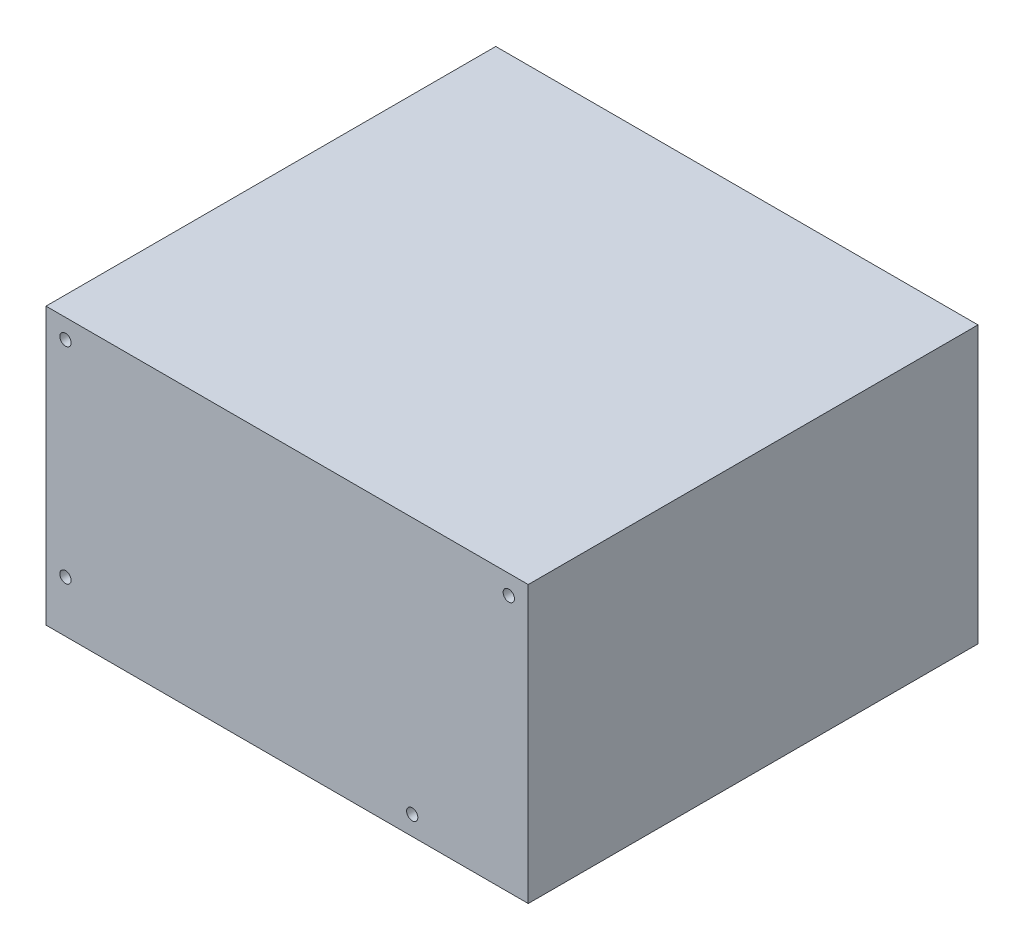
ISO-10303-21;
HEADER;
FILE_DESCRIPTION(('STEP AP214'),'2;1');
FILE_NAME('part.step','',(''),(''),'','','');
FILE_SCHEMA(('AUTOMOTIVE_DESIGN { 1 0 10303 214 1 1 1 1 }'));
ENDSEC;
DATA;
#1=APPLICATION_CONTEXT('core data for automotive mechanical design processes');
#2=APPLICATION_PROTOCOL_DEFINITION('international standard','automotive_design',2000,#1);
#3=PRODUCT_CONTEXT('',#1,'mechanical');
#4=PRODUCT('Part','Part','',(#3));
#5=PRODUCT_RELATED_PRODUCT_CATEGORY('part','',(#4));
#6=PRODUCT_DEFINITION_FORMATION('','',#4);
#7=PRODUCT_DEFINITION_CONTEXT('part definition',#1,'design');
#8=PRODUCT_DEFINITION('design','',#6,#7);
#9=PRODUCT_DEFINITION_SHAPE('','',#8);
#10=(LENGTH_UNIT() NAMED_UNIT(*) SI_UNIT(.MILLI.,.METRE.));
#11=(NAMED_UNIT(*) PLANE_ANGLE_UNIT() SI_UNIT($,.RADIAN.));
#12=(NAMED_UNIT(*) SI_UNIT($,.STERADIAN.) SOLID_ANGLE_UNIT());
#13=UNCERTAINTY_MEASURE_WITH_UNIT(LENGTH_MEASURE(1.E-05),#10,'distance_accuracy_value','');
#14=(GEOMETRIC_REPRESENTATION_CONTEXT(3) GLOBAL_UNCERTAINTY_ASSIGNED_CONTEXT((#13)) GLOBAL_UNIT_ASSIGNED_CONTEXT((#10,
#11,#12)) REPRESENTATION_CONTEXT('',''));
#15=CARTESIAN_POINT('',(0.,0.,0.));
#16=DIRECTION('',(0.,0.,1.));
#17=DIRECTION('',(1.,0.,0.));
#18=AXIS2_PLACEMENT_3D('',#15,#16,#17);
#19=CARTESIAN_POINT('',(0.,0.,-140.));
#20=DIRECTION('',(0.,-1.,0.));
#21=DIRECTION('',(0.,0.,-1.));
#22=AXIS2_PLACEMENT_3D('',#19,#20,#21);
#23=PLANE('',#22);
#24=DIRECTION('',(1.,0.,0.));
#25=VECTOR('',#24,1.);
#26=CARTESIAN_POINT('',(0.,0.,0.));
#27=LINE('',#26,#25);
#28=CARTESIAN_POINT('',(0.,0.,0.));
#29=VERTEX_POINT('',#28);
#30=CARTESIAN_POINT('',(150.114,0.,0.));
#31=VERTEX_POINT('',#30);
#32=EDGE_CURVE('E101',#29,#31,#27,.T.);
#33=ORIENTED_EDGE('',*,*,#32,.F.);
#34=DIRECTION('',(0.,0.,1.));
#35=VECTOR('',#34,1.);
#36=CARTESIAN_POINT('',(0.,0.,-140.));
#37=LINE('',#36,#35);
#38=CARTESIAN_POINT('',(0.,0.,-140.));
#39=VERTEX_POINT('',#38);
#40=EDGE_CURVE('E11',#39,#29,#37,.T.);
#41=ORIENTED_EDGE('',*,*,#40,.F.);
#42=DIRECTION('',(1.,0.,0.));
#43=VECTOR('',#42,1.);
#44=CARTESIAN_POINT('',(0.,0.,-140.));
#45=LINE('',#44,#43);
#46=CARTESIAN_POINT('',(150.114,0.,-140.));
#47=VERTEX_POINT('',#46);
#48=EDGE_CURVE('E95',#39,#47,#45,.T.);
#49=ORIENTED_EDGE('',*,*,#48,.T.);
#50=DIRECTION('',(0.,0.,1.));
#51=VECTOR('',#50,1.);
#52=CARTESIAN_POINT('',(150.114,0.,-140.));
#53=LINE('',#52,#51);
#54=EDGE_CURVE('E38',#47,#31,#53,.T.);
#55=ORIENTED_EDGE('',*,*,#54,.T.);
#56=EDGE_LOOP('',(#33,#41,#49,#55));
#57=FACE_BOUND('',#56,.T.);
#58=ADVANCED_FACE('F35',(#57),#23,.T.);
#59=CARTESIAN_POINT('',(0.,0.,-140.));
#60=DIRECTION('',(1.,0.,0.));
#61=DIRECTION('',(0.,1.,0.));
#62=AXIS2_PLACEMENT_3D('',#59,#60,#61);
#63=PLANE('',#62);
#64=DIRECTION('',(0.,1.,0.));
#65=VECTOR('',#64,1.);
#66=CARTESIAN_POINT('',(0.,0.,0.));
#67=LINE('',#66,#65);
#68=CARTESIAN_POINT('',(0.,86.,0.));
#69=VERTEX_POINT('',#68);
#70=EDGE_CURVE('E68',#29,#69,#67,.T.);
#71=ORIENTED_EDGE('',*,*,#70,.T.);
#72=DIRECTION('',(0.,0.,1.));
#73=VECTOR('',#72,1.);
#74=CARTESIAN_POINT('',(0.,86.,-140.));
#75=LINE('',#74,#73);
#76=CARTESIAN_POINT('',(0.,86.,-140.));
#77=VERTEX_POINT('',#76);
#78=EDGE_CURVE('E44',#77,#69,#75,.T.);
#79=ORIENTED_EDGE('',*,*,#78,.F.);
#80=DIRECTION('',(0.,1.,0.));
#81=VECTOR('',#80,1.);
#82=CARTESIAN_POINT('',(0.,0.,-140.));
#83=LINE('',#82,#81);
#84=EDGE_CURVE('E85',#39,#77,#83,.T.);
#85=ORIENTED_EDGE('',*,*,#84,.F.);
#86=ORIENTED_EDGE('',*,*,#40,.T.);
#87=EDGE_LOOP('',(#71,#79,#85,#86));
#88=FACE_BOUND('',#87,.T.);
#89=ADVANCED_FACE('F112',(#88),#63,.F.);
#90=CARTESIAN_POINT('',(0.,86.,-140.));
#91=DIRECTION('',(0.,-1.,0.));
#92=DIRECTION('',(0.,0.,-1.));
#93=AXIS2_PLACEMENT_3D('',#90,#91,#92);
#94=PLANE('',#93);
#95=DIRECTION('',(1.,0.,0.));
#96=VECTOR('',#95,1.);
#97=CARTESIAN_POINT('',(0.,86.,0.));
#98=LINE('',#97,#96);
#99=CARTESIAN_POINT('',(150.114,86.,0.));
#100=VERTEX_POINT('',#99);
#101=EDGE_CURVE('E92',#69,#100,#98,.T.);
#102=ORIENTED_EDGE('',*,*,#101,.T.);
#103=DIRECTION('',(0.,0.,1.));
#104=VECTOR('',#103,1.);
#105=CARTESIAN_POINT('',(150.114,86.,-140.));
#106=LINE('',#105,#104);
#107=CARTESIAN_POINT('',(150.114,86.,-140.));
#108=VERTEX_POINT('',#107);
#109=EDGE_CURVE('E89',#108,#100,#106,.T.);
#110=ORIENTED_EDGE('',*,*,#109,.F.);
#111=DIRECTION('',(1.,0.,0.));
#112=VECTOR('',#111,1.);
#113=CARTESIAN_POINT('',(0.,86.,-140.));
#114=LINE('',#113,#112);
#115=EDGE_CURVE('E80',#77,#108,#114,.T.);
#116=ORIENTED_EDGE('',*,*,#115,.F.);
#117=ORIENTED_EDGE('',*,*,#78,.T.);
#118=EDGE_LOOP('',(#102,#110,#116,#117));
#119=FACE_BOUND('',#118,.T.);
#120=ADVANCED_FACE('F90',(#119),#94,.F.);
#121=CARTESIAN_POINT('',(150.114,0.,-140.));
#122=DIRECTION('',(1.,0.,0.));
#123=DIRECTION('',(0.,1.,0.));
#124=AXIS2_PLACEMENT_3D('',#121,#122,#123);
#125=PLANE('',#124);
#126=DIRECTION('',(0.,1.,0.));
#127=VECTOR('',#126,1.);
#128=CARTESIAN_POINT('',(150.114,0.,0.));
#129=LINE('',#128,#127);
#130=EDGE_CURVE('E104',#31,#100,#129,.T.);
#131=ORIENTED_EDGE('',*,*,#130,.F.);
#132=ORIENTED_EDGE('',*,*,#54,.F.);
#133=DIRECTION('',(0.,1.,0.));
#134=VECTOR('',#133,1.);
#135=CARTESIAN_POINT('',(150.114,0.,-140.));
#136=LINE('',#135,#134);
#137=EDGE_CURVE('E84',#47,#108,#136,.T.);
#138=ORIENTED_EDGE('',*,*,#137,.T.);
#139=ORIENTED_EDGE('',*,*,#109,.T.);
#140=EDGE_LOOP('',(#131,#132,#138,#139));
#141=FACE_BOUND('',#140,.T.);
#142=ADVANCED_FACE('F94',(#141),#125,.T.);
#143=CARTESIAN_POINT('',(0.,0.,-140.));
#144=DIRECTION('',(0.,0.,1.));
#145=DIRECTION('',(1.,0.,0.));
#146=AXIS2_PLACEMENT_3D('',#143,#144,#145);
#147=PLANE('',#146);
#148=ORIENTED_EDGE('',*,*,#48,.F.);
#149=ORIENTED_EDGE('',*,*,#84,.T.);
#150=ORIENTED_EDGE('',*,*,#115,.T.);
#151=ORIENTED_EDGE('',*,*,#137,.F.);
#152=EDGE_LOOP('',(#148,#149,#150,#151));
#153=FACE_BOUND('',#152,.T.);
#154=ADVANCED_FACE('F83',(#153),#147,.F.);
#155=CARTESIAN_POINT('',(0.,0.,0.));
#156=DIRECTION('',(0.,0.,1.));
#157=DIRECTION('',(1.,0.,0.));
#158=AXIS2_PLACEMENT_3D('',#155,#156,#157);
#159=PLANE('',#158);
#160=CARTESIAN_POINT('',(114.,6.,0.));
#161=DIRECTION('',(0.,0.,1.));
#162=DIRECTION('',(1.,0.,0.));
#163=AXIS2_PLACEMENT_3D('',#160,#161,#162);
#164=CIRCLE('',#163,1.75259999999993);
#165=CARTESIAN_POINT('',(115.7526,6.,0.));
#166=VERTEX_POINT('',#165);
#167=EDGE_CURVE('E169',#166,#166,#164,.T.);
#168=ORIENTED_EDGE('',*,*,#167,.F.);
#169=EDGE_LOOP('',(#168));
#170=FACE_BOUND('',#169,.T.);
#171=CARTESIAN_POINT('',(6.0579,16.,0.));
#172=DIRECTION('',(0.,0.,1.));
#173=DIRECTION('',(1.,0.,0.));
#174=AXIS2_PLACEMENT_3D('',#171,#172,#173);
#175=CIRCLE('',#174,1.75259999999999);
#176=CARTESIAN_POINT('',(7.81049999999999,16.,0.));
#177=VERTEX_POINT('',#176);
#178=EDGE_CURVE('E168',#177,#177,#175,.T.);
#179=ORIENTED_EDGE('',*,*,#178,.F.);
#180=EDGE_LOOP('',(#179));
#181=FACE_BOUND('',#180,.T.);
#182=CARTESIAN_POINT('',(144.0561,80.,0.));
#183=DIRECTION('',(0.,0.,1.));
#184=DIRECTION('',(1.,0.,0.));
#185=AXIS2_PLACEMENT_3D('',#182,#183,#184);
#186=CIRCLE('',#185,1.75259999999991);
#187=CARTESIAN_POINT('',(145.8087,80.,0.));
#188=VERTEX_POINT('',#187);
#189=EDGE_CURVE('E178',#188,#188,#186,.T.);
#190=ORIENTED_EDGE('',*,*,#189,.F.);
#191=EDGE_LOOP('',(#190));
#192=FACE_BOUND('',#191,.T.);
#193=CARTESIAN_POINT('',(6.0579,80.,0.));
#194=DIRECTION('',(0.,0.,1.));
#195=DIRECTION('',(1.,0.,0.));
#196=AXIS2_PLACEMENT_3D('',#193,#194,#195);
#197=CIRCLE('',#196,1.75259999999994);
#198=CARTESIAN_POINT('',(7.81049999999995,80.,0.));
#199=VERTEX_POINT('',#198);
#200=EDGE_CURVE('E183',#199,#199,#197,.T.);
#201=ORIENTED_EDGE('',*,*,#200,.F.);
#202=EDGE_LOOP('',(#201));
#203=FACE_BOUND('',#202,.T.);
#204=ORIENTED_EDGE('',*,*,#32,.T.);
#205=ORIENTED_EDGE('',*,*,#130,.T.);
#206=ORIENTED_EDGE('',*,*,#101,.F.);
#207=ORIENTED_EDGE('',*,*,#70,.F.);
#208=EDGE_LOOP('',(#204,#205,#206,#207));
#209=FACE_BOUND('',#208,.T.);
#210=ADVANCED_FACE('F110',(#170,#181,#192,#203,#209),#159,.T.);
#211=CARTESIAN_POINT('',(6.0579,80.,-127.));
#212=DIRECTION('',(0.,0.,1.));
#213=DIRECTION('',(1.,0.,0.));
#214=AXIS2_PLACEMENT_3D('',#211,#212,#213);
#215=CYLINDRICAL_SURFACE('',#214,1.75259999999994);
#216=CARTESIAN_POINT('',(6.0579,80.,-127.));
#217=DIRECTION('',(0.,0.,1.));
#218=DIRECTION('',(1.,0.,0.));
#219=AXIS2_PLACEMENT_3D('',#216,#217,#218);
#220=CIRCLE('',#219,1.75259999999994);
#221=CARTESIAN_POINT('',(7.81049999999995,80.,-127.));
#222=VERTEX_POINT('',#221);
#223=EDGE_CURVE('E105',#222,#222,#220,.T.);
#224=ORIENTED_EDGE('',*,*,#223,.F.);
#225=EDGE_LOOP('',(#224));
#226=FACE_BOUND('',#225,.T.);
#227=ORIENTED_EDGE('',*,*,#200,.T.);
#228=EDGE_LOOP('',(#227));
#229=FACE_BOUND('',#228,.T.);
#230=ADVANCED_FACE('F130',(#226,#229),#215,.F.);
#231=CARTESIAN_POINT('',(0.,0.,-127.));
#232=DIRECTION('',(0.,0.,1.));
#233=DIRECTION('',(1.,0.,0.));
#234=AXIS2_PLACEMENT_3D('',#231,#232,#233);
#235=PLANE('',#234);
#236=ORIENTED_EDGE('',*,*,#223,.T.);
#237=EDGE_LOOP('',(#236));
#238=FACE_BOUND('',#237,.T.);
#239=ADVANCED_FACE('F135',(#238),#235,.T.);
#240=CARTESIAN_POINT('',(144.0561,80.,-127.));
#241=DIRECTION('',(0.,0.,1.));
#242=DIRECTION('',(1.,0.,0.));
#243=AXIS2_PLACEMENT_3D('',#240,#241,#242);
#244=CYLINDRICAL_SURFACE('',#243,1.75259999999991);
#245=CARTESIAN_POINT('',(144.0561,80.,-127.));
#246=DIRECTION('',(0.,0.,1.));
#247=DIRECTION('',(1.,0.,0.));
#248=AXIS2_PLACEMENT_3D('',#245,#246,#247);
#249=CIRCLE('',#248,1.75259999999991);
#250=CARTESIAN_POINT('',(145.8087,80.,-127.));
#251=VERTEX_POINT('',#250);
#252=EDGE_CURVE('E180',#251,#251,#249,.T.);
#253=ORIENTED_EDGE('',*,*,#252,.F.);
#254=EDGE_LOOP('',(#253));
#255=FACE_BOUND('',#254,.T.);
#256=ORIENTED_EDGE('',*,*,#189,.T.);
#257=EDGE_LOOP('',(#256));
#258=FACE_BOUND('',#257,.T.);
#259=ADVANCED_FACE('F139',(#255,#258),#244,.F.);
#260=CARTESIAN_POINT('',(0.,0.,-127.));
#261=DIRECTION('',(0.,0.,1.));
#262=DIRECTION('',(1.,0.,0.));
#263=AXIS2_PLACEMENT_3D('',#260,#261,#262);
#264=PLANE('',#263);
#265=ORIENTED_EDGE('',*,*,#252,.T.);
#266=EDGE_LOOP('',(#265));
#267=FACE_BOUND('',#266,.T.);
#268=ADVANCED_FACE('F143',(#267),#264,.T.);
#269=CARTESIAN_POINT('',(6.0579,16.,-127.));
#270=DIRECTION('',(0.,0.,1.));
#271=DIRECTION('',(1.,0.,0.));
#272=AXIS2_PLACEMENT_3D('',#269,#270,#271);
#273=CYLINDRICAL_SURFACE('',#272,1.75259999999999);
#274=CARTESIAN_POINT('',(6.0579,16.,-127.));
#275=DIRECTION('',(0.,0.,1.));
#276=DIRECTION('',(1.,0.,0.));
#277=AXIS2_PLACEMENT_3D('',#274,#275,#276);
#278=CIRCLE('',#277,1.75259999999999);
#279=CARTESIAN_POINT('',(7.81049999999999,16.,-127.));
#280=VERTEX_POINT('',#279);
#281=EDGE_CURVE('E172',#280,#280,#278,.T.);
#282=ORIENTED_EDGE('',*,*,#281,.F.);
#283=EDGE_LOOP('',(#282));
#284=FACE_BOUND('',#283,.T.);
#285=ORIENTED_EDGE('',*,*,#178,.T.);
#286=EDGE_LOOP('',(#285));
#287=FACE_BOUND('',#286,.T.);
#288=ADVANCED_FACE('F147',(#284,#287),#273,.F.);
#289=CARTESIAN_POINT('',(0.,0.,-127.));
#290=DIRECTION('',(0.,0.,1.));
#291=DIRECTION('',(1.,0.,0.));
#292=AXIS2_PLACEMENT_3D('',#289,#290,#291);
#293=PLANE('',#292);
#294=ORIENTED_EDGE('',*,*,#281,.T.);
#295=EDGE_LOOP('',(#294));
#296=FACE_BOUND('',#295,.T.);
#297=ADVANCED_FACE('F151',(#296),#293,.T.);
#298=CARTESIAN_POINT('',(114.,6.,-127.));
#299=DIRECTION('',(0.,0.,1.));
#300=DIRECTION('',(1.,0.,0.));
#301=AXIS2_PLACEMENT_3D('',#298,#299,#300);
#302=CYLINDRICAL_SURFACE('',#301,1.75259999999993);
#303=CARTESIAN_POINT('',(114.,6.,-127.));
#304=DIRECTION('',(0.,0.,1.));
#305=DIRECTION('',(1.,0.,0.));
#306=AXIS2_PLACEMENT_3D('',#303,#304,#305);
#307=CIRCLE('',#306,1.75259999999993);
#308=CARTESIAN_POINT('',(115.7526,6.,-127.));
#309=VERTEX_POINT('',#308);
#310=EDGE_CURVE('E167',#309,#309,#307,.T.);
#311=ORIENTED_EDGE('',*,*,#310,.F.);
#312=EDGE_LOOP('',(#311));
#313=FACE_BOUND('',#312,.T.);
#314=ORIENTED_EDGE('',*,*,#167,.T.);
#315=EDGE_LOOP('',(#314));
#316=FACE_BOUND('',#315,.T.);
#317=ADVANCED_FACE('F155',(#313,#316),#302,.F.);
#318=CARTESIAN_POINT('',(0.,0.,-127.));
#319=DIRECTION('',(0.,0.,1.));
#320=DIRECTION('',(1.,0.,0.));
#321=AXIS2_PLACEMENT_3D('',#318,#319,#320);
#322=PLANE('',#321);
#323=ORIENTED_EDGE('',*,*,#310,.T.);
#324=EDGE_LOOP('',(#323));
#325=FACE_BOUND('',#324,.T.);
#326=ADVANCED_FACE('F159',(#325),#322,.T.);
#327=CLOSED_SHELL('',(#58,#89,#120,#142,#154,#210,#230,#239,#259,#268,#288,#297,#317,#326));
#328=MANIFOLD_SOLID_BREP('B2',#327);
#329=ADVANCED_BREP_SHAPE_REPRESENTATION('',(#18,#328),#14);
#330=SHAPE_DEFINITION_REPRESENTATION(#9,#329);
ENDSEC;
END-ISO-10303-21;
